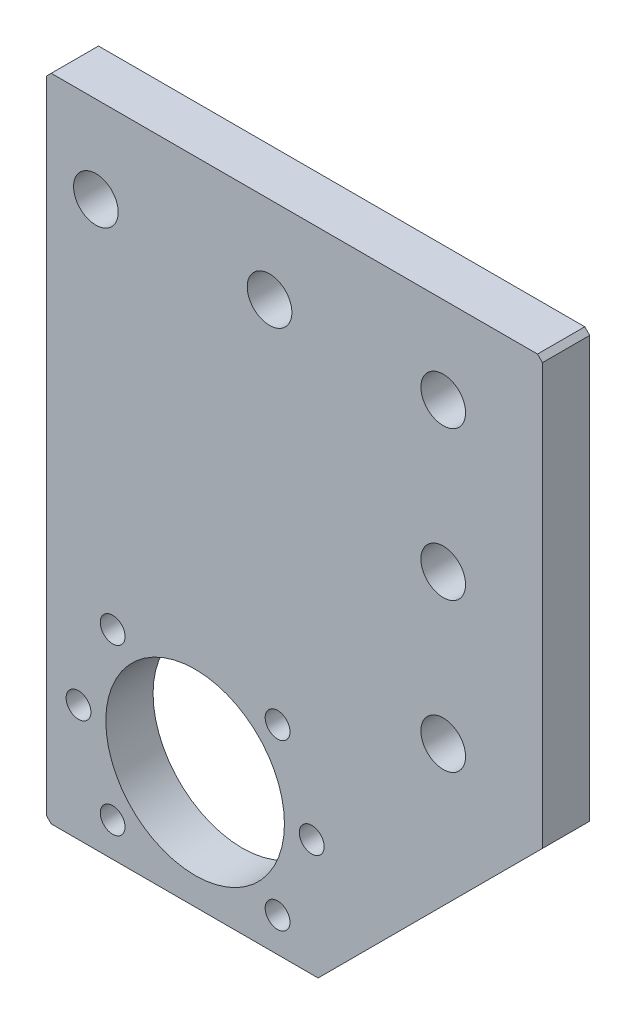
ISO-10303-21;
HEADER;
FILE_DESCRIPTION(('STEP AP214'),'2;1');
FILE_NAME('part.step','',(''),(''),'','','');
FILE_SCHEMA(('AUTOMOTIVE_DESIGN { 1 0 10303 214 1 1 1 1 }'));
ENDSEC;
DATA;
#1=APPLICATION_CONTEXT('core data for automotive mechanical design processes');
#2=APPLICATION_PROTOCOL_DEFINITION('international standard','automotive_design',2000,#1);
#3=PRODUCT_CONTEXT('',#1,'mechanical');
#4=PRODUCT('Part','Part','',(#3));
#5=PRODUCT_RELATED_PRODUCT_CATEGORY('part','',(#4));
#6=PRODUCT_DEFINITION_FORMATION('','',#4);
#7=PRODUCT_DEFINITION_CONTEXT('part definition',#1,'design');
#8=PRODUCT_DEFINITION('design','',#6,#7);
#9=PRODUCT_DEFINITION_SHAPE('','',#8);
#10=(LENGTH_UNIT() NAMED_UNIT(*) SI_UNIT(.MILLI.,.METRE.));
#11=(NAMED_UNIT(*) PLANE_ANGLE_UNIT() SI_UNIT($,.RADIAN.));
#12=(NAMED_UNIT(*) SI_UNIT($,.STERADIAN.) SOLID_ANGLE_UNIT());
#13=UNCERTAINTY_MEASURE_WITH_UNIT(LENGTH_MEASURE(1.E-05),#10,'distance_accuracy_value','');
#14=(GEOMETRIC_REPRESENTATION_CONTEXT(3) GLOBAL_UNCERTAINTY_ASSIGNED_CONTEXT((#13)) GLOBAL_UNIT_ASSIGNED_CONTEXT((#10,
#11,#12)) REPRESENTATION_CONTEXT('',''));
#15=CARTESIAN_POINT('',(0.,0.,0.));
#16=DIRECTION('',(0.,0.,1.));
#17=DIRECTION('',(1.,0.,0.));
#18=AXIS2_PLACEMENT_3D('',#15,#16,#17);
#19=CARTESIAN_POINT('',(0.,0.,4.7625));
#20=DIRECTION('',(0.,0.,-1.));
#21=DIRECTION('',(-1.,0.,0.));
#22=AXIS2_PLACEMENT_3D('',#19,#20,#21);
#23=PLANE('',#22);
#24=DIRECTION('',(0.,-1.,0.));
#25=VECTOR('',#24,1.);
#26=CARTESIAN_POINT('',(-30.,-23.5,4.7625));
#27=LINE('',#26,#25);
#28=CARTESIAN_POINT('',(-30.,106.5,4.7625));
#29=VERTEX_POINT('',#28);
#30=CARTESIAN_POINT('',(-30.,-22.5,4.7625));
#31=VERTEX_POINT('',#30);
#32=EDGE_CURVE('E124',#29,#31,#27,.T.);
#33=ORIENTED_EDGE('',*,*,#32,.T.);
#34=DIRECTION('',(-0.707106781186548,0.707106781186548,0.));
#35=VECTOR('',#34,1.);
#36=CARTESIAN_POINT('',(-29.,-23.5,4.7625));
#37=LINE('',#36,#35);
#38=CARTESIAN_POINT('',(-29.,-23.5,4.7625));
#39=VERTEX_POINT('',#38);
#40=EDGE_CURVE('E119',#31,#39,#37,.F.);
#41=ORIENTED_EDGE('',*,*,#40,.T.);
#42=DIRECTION('',(1.,0.,0.));
#43=VECTOR('',#42,1.);
#44=CARTESIAN_POINT('',(-30.,-23.5,4.7625));
#45=LINE('',#44,#43);
#46=CARTESIAN_POINT('',(24.7842712474621,-23.5,4.7625));
#47=VERTEX_POINT('',#46);
#48=EDGE_CURVE('E111',#39,#47,#45,.T.);
#49=ORIENTED_EDGE('',*,*,#48,.T.);
#50=DIRECTION('',(0.707106781186546,0.707106781186549,0.));
#51=VECTOR('',#50,1.);
#52=CARTESIAN_POINT('',(24.7842712474621,-23.5,4.7625));
#53=LINE('',#52,#51);
#54=CARTESIAN_POINT('',(70.,21.7157287525381,4.7625));
#55=VERTEX_POINT('',#54);
#56=EDGE_CURVE('E116',#47,#55,#53,.T.);
#57=ORIENTED_EDGE('',*,*,#56,.T.);
#58=DIRECTION('',(0.,1.,0.));
#59=VECTOR('',#58,1.);
#60=CARTESIAN_POINT('',(70.,21.7157287525381,4.7625));
#61=LINE('',#60,#59);
#62=CARTESIAN_POINT('',(70.,106.5,4.7625));
#63=VERTEX_POINT('',#62);
#64=EDGE_CURVE('E141',#55,#63,#61,.T.);
#65=ORIENTED_EDGE('',*,*,#64,.T.);
#66=DIRECTION('',(0.707106781186548,-0.707106781186548,0.));
#67=VECTOR('',#66,1.);
#68=CARTESIAN_POINT('',(69.,107.5,4.7625));
#69=LINE('',#68,#67);
#70=CARTESIAN_POINT('',(69.,107.5,4.7625));
#71=VERTEX_POINT('',#70);
#72=EDGE_CURVE('E69',#63,#71,#69,.F.);
#73=ORIENTED_EDGE('',*,*,#72,.T.);
#74=DIRECTION('',(-1.,0.,0.));
#75=VECTOR('',#74,1.);
#76=CARTESIAN_POINT('',(-30.,107.5,4.7625));
#77=LINE('',#76,#75);
#78=CARTESIAN_POINT('',(-29.,107.5,4.7625));
#79=VERTEX_POINT('',#78);
#80=EDGE_CURVE('E144',#71,#79,#77,.T.);
#81=ORIENTED_EDGE('',*,*,#80,.T.);
#82=DIRECTION('',(0.707106781186533,0.707106781186562,0.));
#83=VECTOR('',#82,1.);
#84=CARTESIAN_POINT('',(-30.,106.5,4.7625));
#85=LINE('',#84,#83);
#86=EDGE_CURVE('E187',#79,#29,#85,.F.);
#87=ORIENTED_EDGE('',*,*,#86,.T.);
#88=EDGE_LOOP('',(#33,#41,#49,#57,#65,#73,#81,#87));
#89=FACE_BOUND('',#88,.T.);
#90=CARTESIAN_POINT('',(0.,0.,4.7625));
#91=DIRECTION('',(0.,0.,1.));
#92=DIRECTION('',(1.,0.,0.));
#93=AXIS2_PLACEMENT_3D('',#90,#91,#92);
#94=CIRCLE('',#93,18.);
#95=CARTESIAN_POINT('',(-18.,0.,4.7625));
#96=VERTEX_POINT('',#95);
#97=EDGE_CURVE('E154',#96,#96,#94,.T.);
#98=ORIENTED_EDGE('',*,*,#97,.F.);
#99=EDGE_LOOP('',(#98));
#100=FACE_BOUND('',#99,.T.);
#101=CARTESIAN_POINT('',(50.,30.,4.7625));
#102=DIRECTION('',(0.,0.,1.));
#103=DIRECTION('',(1.,0.,0.));
#104=AXIS2_PLACEMENT_3D('',#101,#102,#103);
#105=CIRCLE('',#104,4.5);
#106=CARTESIAN_POINT('',(54.5,30.,4.7625));
#107=VERTEX_POINT('',#106);
#108=EDGE_CURVE('E226',#107,#107,#105,.T.);
#109=ORIENTED_EDGE('',*,*,#108,.F.);
#110=EDGE_LOOP('',(#109));
#111=FACE_BOUND('',#110,.T.);
#112=CARTESIAN_POINT('',(50.,60.,4.7625));
#113=DIRECTION('',(0.,0.,1.));
#114=DIRECTION('',(1.,0.,0.));
#115=AXIS2_PLACEMENT_3D('',#112,#113,#114);
#116=CIRCLE('',#115,4.5);
#117=CARTESIAN_POINT('',(54.5,60.,4.7625));
#118=VERTEX_POINT('',#117);
#119=EDGE_CURVE('E234',#118,#118,#116,.T.);
#120=ORIENTED_EDGE('',*,*,#119,.F.);
#121=EDGE_LOOP('',(#120));
#122=FACE_BOUND('',#121,.T.);
#123=CARTESIAN_POINT('',(50.,90.,4.7625));
#124=DIRECTION('',(0.,0.,1.));
#125=DIRECTION('',(1.,0.,0.));
#126=AXIS2_PLACEMENT_3D('',#123,#124,#125);
#127=CIRCLE('',#126,4.5);
#128=CARTESIAN_POINT('',(54.5,90.,4.7625));
#129=VERTEX_POINT('',#128);
#130=EDGE_CURVE('E242',#129,#129,#127,.T.);
#131=ORIENTED_EDGE('',*,*,#130,.F.);
#132=EDGE_LOOP('',(#131));
#133=FACE_BOUND('',#132,.T.);
#134=CARTESIAN_POINT('',(15.,90.,4.7625));
#135=DIRECTION('',(0.,0.,1.));
#136=DIRECTION('',(1.,0.,0.));
#137=AXIS2_PLACEMENT_3D('',#134,#135,#136);
#138=CIRCLE('',#137,4.5);
#139=CARTESIAN_POINT('',(19.5,90.,4.7625));
#140=VERTEX_POINT('',#139);
#141=EDGE_CURVE('E250',#140,#140,#138,.T.);
#142=ORIENTED_EDGE('',*,*,#141,.F.);
#143=EDGE_LOOP('',(#142));
#144=FACE_BOUND('',#143,.T.);
#145=CARTESIAN_POINT('',(-20.,90.,4.7625));
#146=DIRECTION('',(0.,0.,1.));
#147=DIRECTION('',(1.,0.,0.));
#148=AXIS2_PLACEMENT_3D('',#145,#146,#147);
#149=CIRCLE('',#148,4.5);
#150=CARTESIAN_POINT('',(-15.5,90.,4.7625));
#151=VERTEX_POINT('',#150);
#152=EDGE_CURVE('E258',#151,#151,#149,.T.);
#153=ORIENTED_EDGE('',*,*,#152,.F.);
#154=EDGE_LOOP('',(#153));
#155=FACE_BOUND('',#154,.T.);
#156=CARTESIAN_POINT('',(-16.6170093578841,16.6170093578837,4.7625));
#157=DIRECTION('',(0.,0.,1.));
#158=DIRECTION('',(1.,0.,0.));
#159=AXIS2_PLACEMENT_3D('',#156,#157,#158);
#160=CIRCLE('',#159,2.5);
#161=CARTESIAN_POINT('',(-14.1170093578841,16.6170093578837,4.7625));
#162=VERTEX_POINT('',#161);
#163=EDGE_CURVE('E266',#162,#162,#160,.T.);
#164=ORIENTED_EDGE('',*,*,#163,.F.);
#165=EDGE_LOOP('',(#164));
#166=FACE_BOUND('',#165,.T.);
#167=CARTESIAN_POINT('',(-23.5,-2.49756583940482E-13,4.7625));
#168=DIRECTION('',(0.,0.,1.));
#169=DIRECTION('',(1.,0.,0.));
#170=AXIS2_PLACEMENT_3D('',#167,#168,#169);
#171=CIRCLE('',#170,2.5);
#172=CARTESIAN_POINT('',(-21.,-2.49756583940482E-13,4.7625));
#173=VERTEX_POINT('',#172);
#174=EDGE_CURVE('E274',#173,#173,#171,.T.);
#175=ORIENTED_EDGE('',*,*,#174,.F.);
#176=EDGE_LOOP('',(#175));
#177=FACE_BOUND('',#176,.T.);
#178=CARTESIAN_POINT('',(-16.6170093578837,-16.617009357884,4.7625));
#179=DIRECTION('',(0.,0.,1.));
#180=DIRECTION('',(1.,0.,0.));
#181=AXIS2_PLACEMENT_3D('',#178,#179,#180);
#182=CIRCLE('',#181,2.5);
#183=CARTESIAN_POINT('',(-14.1170093578837,-16.617009357884,4.7625));
#184=VERTEX_POINT('',#183);
#185=EDGE_CURVE('E282',#184,#184,#182,.T.);
#186=ORIENTED_EDGE('',*,*,#185,.F.);
#187=EDGE_LOOP('',(#186));
#188=FACE_BOUND('',#187,.T.);
#189=CARTESIAN_POINT('',(16.6170093578839,-16.6170093578839,4.7625));
#190=DIRECTION('',(0.,0.,1.));
#191=DIRECTION('',(1.,0.,0.));
#192=AXIS2_PLACEMENT_3D('',#189,#190,#191);
#193=CIRCLE('',#192,2.5);
#194=CARTESIAN_POINT('',(19.1170093578839,-16.6170093578839,4.7625));
#195=VERTEX_POINT('',#194);
#196=EDGE_CURVE('E290',#195,#195,#193,.T.);
#197=ORIENTED_EDGE('',*,*,#196,.F.);
#198=EDGE_LOOP('',(#197));
#199=FACE_BOUND('',#198,.T.);
#200=CARTESIAN_POINT('',(23.5,0.,4.7625));
#201=DIRECTION('',(0.,0.,1.));
#202=DIRECTION('',(1.,0.,0.));
#203=AXIS2_PLACEMENT_3D('',#200,#201,#202);
#204=CIRCLE('',#203,2.5);
#205=CARTESIAN_POINT('',(26.,0.,4.7625));
#206=VERTEX_POINT('',#205);
#207=EDGE_CURVE('E298',#206,#206,#204,.T.);
#208=ORIENTED_EDGE('',*,*,#207,.F.);
#209=EDGE_LOOP('',(#208));
#210=FACE_BOUND('',#209,.T.);
#211=CARTESIAN_POINT('',(16.6170093578839,16.6170093578839,4.7625));
#212=DIRECTION('',(0.,0.,1.));
#213=DIRECTION('',(1.,0.,0.));
#214=AXIS2_PLACEMENT_3D('',#211,#212,#213);
#215=CIRCLE('',#214,2.5);
#216=CARTESIAN_POINT('',(19.1170093578839,16.6170093578839,4.7625));
#217=VERTEX_POINT('',#216);
#218=EDGE_CURVE('E306',#217,#217,#215,.T.);
#219=ORIENTED_EDGE('',*,*,#218,.F.);
#220=EDGE_LOOP('',(#219));
#221=FACE_BOUND('',#220,.T.);
#222=ADVANCED_FACE('F45',(#89,#100,#111,#122,#133,#144,#155,#166,#177,#188,#199,#210,#221),#23,.F.);
#223=CARTESIAN_POINT('',(0.,0.,-4.7625));
#224=DIRECTION('',(0.,0.,-1.));
#225=DIRECTION('',(-1.,0.,0.));
#226=AXIS2_PLACEMENT_3D('',#223,#224,#225);
#227=PLANE('',#226);
#228=CARTESIAN_POINT('',(16.6170093578839,16.6170093578839,-4.7625));
#229=DIRECTION('',(0.,0.,-1.));
#230=DIRECTION('',(-1.,0.,0.));
#231=AXIS2_PLACEMENT_3D('',#228,#229,#230);
#232=CIRCLE('',#231,2.5);
#233=CARTESIAN_POINT('',(14.1170093578839,16.6170093578839,-4.7625));
#234=VERTEX_POINT('',#233);
#235=EDGE_CURVE('E302',#234,#234,#232,.T.);
#236=ORIENTED_EDGE('',*,*,#235,.F.);
#237=EDGE_LOOP('',(#236));
#238=FACE_BOUND('',#237,.T.);
#239=CARTESIAN_POINT('',(23.5,0.,-4.7625));
#240=DIRECTION('',(0.,0.,-1.));
#241=DIRECTION('',(-1.,0.,0.));
#242=AXIS2_PLACEMENT_3D('',#239,#240,#241);
#243=CIRCLE('',#242,2.5);
#244=CARTESIAN_POINT('',(21.,0.,-4.7625));
#245=VERTEX_POINT('',#244);
#246=EDGE_CURVE('E294',#245,#245,#243,.T.);
#247=ORIENTED_EDGE('',*,*,#246,.F.);
#248=EDGE_LOOP('',(#247));
#249=FACE_BOUND('',#248,.T.);
#250=CARTESIAN_POINT('',(16.6170093578839,-16.6170093578839,-4.7625));
#251=DIRECTION('',(0.,0.,-1.));
#252=DIRECTION('',(-1.,0.,0.));
#253=AXIS2_PLACEMENT_3D('',#250,#251,#252);
#254=CIRCLE('',#253,2.5);
#255=CARTESIAN_POINT('',(14.1170093578839,-16.6170093578839,-4.7625));
#256=VERTEX_POINT('',#255);
#257=EDGE_CURVE('E286',#256,#256,#254,.T.);
#258=ORIENTED_EDGE('',*,*,#257,.F.);
#259=EDGE_LOOP('',(#258));
#260=FACE_BOUND('',#259,.T.);
#261=CARTESIAN_POINT('',(-16.6170093578837,-16.617009357884,-4.7625));
#262=DIRECTION('',(0.,0.,-1.));
#263=DIRECTION('',(-1.,0.,0.));
#264=AXIS2_PLACEMENT_3D('',#261,#262,#263);
#265=CIRCLE('',#264,2.5);
#266=CARTESIAN_POINT('',(-19.1170093578837,-16.617009357884,-4.7625));
#267=VERTEX_POINT('',#266);
#268=EDGE_CURVE('E278',#267,#267,#265,.T.);
#269=ORIENTED_EDGE('',*,*,#268,.F.);
#270=EDGE_LOOP('',(#269));
#271=FACE_BOUND('',#270,.T.);
#272=CARTESIAN_POINT('',(-23.5,-2.49756583940482E-13,-4.7625));
#273=DIRECTION('',(0.,0.,-1.));
#274=DIRECTION('',(-1.,0.,0.));
#275=AXIS2_PLACEMENT_3D('',#272,#273,#274);
#276=CIRCLE('',#275,2.5);
#277=CARTESIAN_POINT('',(-26.,-2.49756583940482E-13,-4.7625));
#278=VERTEX_POINT('',#277);
#279=EDGE_CURVE('E270',#278,#278,#276,.T.);
#280=ORIENTED_EDGE('',*,*,#279,.F.);
#281=EDGE_LOOP('',(#280));
#282=FACE_BOUND('',#281,.T.);
#283=CARTESIAN_POINT('',(-16.6170093578841,16.6170093578837,-4.7625));
#284=DIRECTION('',(0.,0.,-1.));
#285=DIRECTION('',(-1.,0.,0.));
#286=AXIS2_PLACEMENT_3D('',#283,#284,#285);
#287=CIRCLE('',#286,2.5);
#288=CARTESIAN_POINT('',(-19.1170093578841,16.6170093578837,-4.7625));
#289=VERTEX_POINT('',#288);
#290=EDGE_CURVE('E262',#289,#289,#287,.T.);
#291=ORIENTED_EDGE('',*,*,#290,.F.);
#292=EDGE_LOOP('',(#291));
#293=FACE_BOUND('',#292,.T.);
#294=CARTESIAN_POINT('',(-20.,90.,-4.7625));
#295=DIRECTION('',(0.,0.,-1.));
#296=DIRECTION('',(-1.,0.,0.));
#297=AXIS2_PLACEMENT_3D('',#294,#295,#296);
#298=CIRCLE('',#297,4.5);
#299=CARTESIAN_POINT('',(-24.5,90.,-4.7625));
#300=VERTEX_POINT('',#299);
#301=EDGE_CURVE('E254',#300,#300,#298,.T.);
#302=ORIENTED_EDGE('',*,*,#301,.F.);
#303=EDGE_LOOP('',(#302));
#304=FACE_BOUND('',#303,.T.);
#305=CARTESIAN_POINT('',(15.,90.,-4.7625));
#306=DIRECTION('',(0.,0.,-1.));
#307=DIRECTION('',(-1.,0.,0.));
#308=AXIS2_PLACEMENT_3D('',#305,#306,#307);
#309=CIRCLE('',#308,4.5);
#310=CARTESIAN_POINT('',(10.5,90.,-4.7625));
#311=VERTEX_POINT('',#310);
#312=EDGE_CURVE('E246',#311,#311,#309,.T.);
#313=ORIENTED_EDGE('',*,*,#312,.F.);
#314=EDGE_LOOP('',(#313));
#315=FACE_BOUND('',#314,.T.);
#316=CARTESIAN_POINT('',(50.,90.,-4.7625));
#317=DIRECTION('',(0.,0.,-1.));
#318=DIRECTION('',(-1.,0.,0.));
#319=AXIS2_PLACEMENT_3D('',#316,#317,#318);
#320=CIRCLE('',#319,4.5);
#321=CARTESIAN_POINT('',(45.5,90.,-4.7625));
#322=VERTEX_POINT('',#321);
#323=EDGE_CURVE('E238',#322,#322,#320,.T.);
#324=ORIENTED_EDGE('',*,*,#323,.F.);
#325=EDGE_LOOP('',(#324));
#326=FACE_BOUND('',#325,.T.);
#327=CARTESIAN_POINT('',(50.,60.,-4.7625));
#328=DIRECTION('',(0.,0.,-1.));
#329=DIRECTION('',(-1.,0.,0.));
#330=AXIS2_PLACEMENT_3D('',#327,#328,#329);
#331=CIRCLE('',#330,4.5);
#332=CARTESIAN_POINT('',(45.5,60.,-4.7625));
#333=VERTEX_POINT('',#332);
#334=EDGE_CURVE('E230',#333,#333,#331,.T.);
#335=ORIENTED_EDGE('',*,*,#334,.F.);
#336=EDGE_LOOP('',(#335));
#337=FACE_BOUND('',#336,.T.);
#338=CARTESIAN_POINT('',(50.,30.,-4.7625));
#339=DIRECTION('',(0.,0.,-1.));
#340=DIRECTION('',(-1.,0.,0.));
#341=AXIS2_PLACEMENT_3D('',#338,#339,#340);
#342=CIRCLE('',#341,4.5);
#343=CARTESIAN_POINT('',(45.5,30.,-4.7625));
#344=VERTEX_POINT('',#343);
#345=EDGE_CURVE('E219',#344,#344,#342,.T.);
#346=ORIENTED_EDGE('',*,*,#345,.F.);
#347=EDGE_LOOP('',(#346));
#348=FACE_BOUND('',#347,.T.);
#349=DIRECTION('',(1.,0.,0.));
#350=VECTOR('',#349,1.);
#351=CARTESIAN_POINT('',(-30.,-23.5,-4.7625));
#352=LINE('',#351,#350);
#353=CARTESIAN_POINT('',(-29.,-23.5,-4.7625));
#354=VERTEX_POINT('',#353);
#355=CARTESIAN_POINT('',(24.7842712474621,-23.5,-4.7625));
#356=VERTEX_POINT('',#355);
#357=EDGE_CURVE('E130',#354,#356,#352,.T.);
#358=ORIENTED_EDGE('',*,*,#357,.F.);
#359=DIRECTION('',(0.707106781186548,-0.707106781186548,0.));
#360=VECTOR('',#359,1.);
#361=CARTESIAN_POINT('',(-26.25,-26.25,-4.7625));
#362=LINE('',#361,#360);
#363=CARTESIAN_POINT('',(-30.,-22.5,-4.7625));
#364=VERTEX_POINT('',#363);
#365=EDGE_CURVE('E177',#354,#364,#362,.F.);
#366=ORIENTED_EDGE('',*,*,#365,.T.);
#367=DIRECTION('',(0.,-1.,0.));
#368=VECTOR('',#367,1.);
#369=CARTESIAN_POINT('',(-30.,-23.5,-4.7625));
#370=LINE('',#369,#368);
#371=CARTESIAN_POINT('',(-30.,106.5,-4.7625));
#372=VERTEX_POINT('',#371);
#373=EDGE_CURVE('E150',#372,#364,#370,.T.);
#374=ORIENTED_EDGE('',*,*,#373,.F.);
#375=DIRECTION('',(-0.707106781186533,-0.707106781186562,0.));
#376=VECTOR('',#375,1.);
#377=CARTESIAN_POINT('',(-68.2500000000006,68.2499999999978,-4.7625));
#378=LINE('',#377,#376);
#379=CARTESIAN_POINT('',(-29.,107.5,-4.7625));
#380=VERTEX_POINT('',#379);
#381=EDGE_CURVE('E171',#372,#380,#378,.F.);
#382=ORIENTED_EDGE('',*,*,#381,.T.);
#383=DIRECTION('',(-1.,0.,0.));
#384=VECTOR('',#383,1.);
#385=CARTESIAN_POINT('',(-30.,107.5,-4.7625));
#386=LINE('',#385,#384);
#387=CARTESIAN_POINT('',(69.,107.5,-4.7625));
#388=VERTEX_POINT('',#387);
#389=EDGE_CURVE('E164',#388,#380,#386,.T.);
#390=ORIENTED_EDGE('',*,*,#389,.F.);
#391=DIRECTION('',(-0.707106781186548,0.707106781186548,0.));
#392=VECTOR('',#391,1.);
#393=CARTESIAN_POINT('',(88.25,88.25,-4.7625));
#394=LINE('',#393,#392);
#395=CARTESIAN_POINT('',(70.,106.5,-4.7625));
#396=VERTEX_POINT('',#395);
#397=EDGE_CURVE('E174',#388,#396,#394,.F.);
#398=ORIENTED_EDGE('',*,*,#397,.T.);
#399=DIRECTION('',(0.,1.,0.));
#400=VECTOR('',#399,1.);
#401=CARTESIAN_POINT('',(70.,21.7157287525381,-4.7625));
#402=LINE('',#401,#400);
#403=CARTESIAN_POINT('',(70.,21.7157287525381,-4.7625));
#404=VERTEX_POINT('',#403);
#405=EDGE_CURVE('E160',#404,#396,#402,.T.);
#406=ORIENTED_EDGE('',*,*,#405,.F.);
#407=DIRECTION('',(0.707106781186546,0.707106781186549,0.));
#408=VECTOR('',#407,1.);
#409=CARTESIAN_POINT('',(24.7842712474621,-23.5,-4.7625));
#410=LINE('',#409,#408);
#411=EDGE_CURVE('E157',#356,#404,#410,.T.);
#412=ORIENTED_EDGE('',*,*,#411,.F.);
#413=EDGE_LOOP('',(#358,#366,#374,#382,#390,#398,#406,#412));
#414=FACE_BOUND('',#413,.T.);
#415=CARTESIAN_POINT('',(0.,0.,-4.7625));
#416=DIRECTION('',(0.,0.,1.));
#417=DIRECTION('',(1.,0.,0.));
#418=AXIS2_PLACEMENT_3D('',#415,#416,#417);
#419=CIRCLE('',#418,18.);
#420=CARTESIAN_POINT('',(-18.,0.,-4.7625));
#421=VERTEX_POINT('',#420);
#422=EDGE_CURVE('E215',#421,#421,#419,.T.);
#423=ORIENTED_EDGE('',*,*,#422,.T.);
#424=EDGE_LOOP('',(#423));
#425=FACE_BOUND('',#424,.T.);
#426=ADVANCED_FACE('F202',(#238,#249,#260,#271,#282,#293,#304,#315,#326,#337,#348,#414,#425),
#227,.T.);
#427=CARTESIAN_POINT('',(-30.,-23.5,4.7625));
#428=DIRECTION('',(1.,0.,0.));
#429=DIRECTION('',(0.,0.,-1.));
#430=AXIS2_PLACEMENT_3D('',#427,#428,#429);
#431=PLANE('',#430);
#432=ORIENTED_EDGE('',*,*,#373,.T.);
#433=DIRECTION('',(0.,0.,1.));
#434=VECTOR('',#433,1.);
#435=CARTESIAN_POINT('',(-30.,-22.5,4.7625));
#436=LINE('',#435,#434);
#437=EDGE_CURVE('E184',#364,#31,#436,.T.);
#438=ORIENTED_EDGE('',*,*,#437,.T.);
#439=ORIENTED_EDGE('',*,*,#32,.F.);
#440=DIRECTION('',(0.,0.,-1.));
#441=VECTOR('',#440,1.);
#442=CARTESIAN_POINT('',(-30.,106.5,4.7625));
#443=LINE('',#442,#441);
#444=EDGE_CURVE('E180',#29,#372,#443,.T.);
#445=ORIENTED_EDGE('',*,*,#444,.T.);
#446=EDGE_LOOP('',(#432,#438,#439,#445));
#447=FACE_BOUND('',#446,.T.);
#448=ADVANCED_FACE('F211',(#447),#431,.F.);
#449=CARTESIAN_POINT('',(-30.,-23.5,4.7625));
#450=DIRECTION('',(0.,1.,0.));
#451=DIRECTION('',(0.,0.,1.));
#452=AXIS2_PLACEMENT_3D('',#449,#450,#451);
#453=PLANE('',#452);
#454=ORIENTED_EDGE('',*,*,#48,.F.);
#455=DIRECTION('',(0.,0.,-1.));
#456=VECTOR('',#455,1.);
#457=CARTESIAN_POINT('',(-29.,-23.5,4.7625));
#458=LINE('',#457,#456);
#459=EDGE_CURVE('E134',#39,#354,#458,.T.);
#460=ORIENTED_EDGE('',*,*,#459,.T.);
#461=ORIENTED_EDGE('',*,*,#357,.T.);
#462=DIRECTION('',(0.,0.,-1.));
#463=VECTOR('',#462,1.);
#464=CARTESIAN_POINT('',(24.7842712474621,-23.5,4.7625));
#465=LINE('',#464,#463);
#466=EDGE_CURVE('E127',#47,#356,#465,.T.);
#467=ORIENTED_EDGE('',*,*,#466,.F.);
#468=EDGE_LOOP('',(#454,#460,#461,#467));
#469=FACE_BOUND('',#468,.T.);
#470=ADVANCED_FACE('F128',(#469),#453,.F.);
#471=CARTESIAN_POINT('',(24.7842712474621,-23.5,4.7625));
#472=DIRECTION('',(-0.707106781186549,0.707106781186546,0.));
#473=DIRECTION('',(-0.707106781186546,-0.707106781186549,0.));
#474=AXIS2_PLACEMENT_3D('',#471,#472,#473);
#475=PLANE('',#474);
#476=ORIENTED_EDGE('',*,*,#411,.T.);
#477=DIRECTION('',(0.,0.,-1.));
#478=VECTOR('',#477,1.);
#479=CARTESIAN_POINT('',(70.,21.7157287525381,4.7625));
#480=LINE('',#479,#478);
#481=EDGE_CURVE('E135',#55,#404,#480,.T.);
#482=ORIENTED_EDGE('',*,*,#481,.F.);
#483=ORIENTED_EDGE('',*,*,#56,.F.);
#484=ORIENTED_EDGE('',*,*,#466,.T.);
#485=EDGE_LOOP('',(#476,#482,#483,#484));
#486=FACE_BOUND('',#485,.T.);
#487=ADVANCED_FACE('F137',(#486),#475,.F.);
#488=CARTESIAN_POINT('',(70.,21.7157287525381,4.7625));
#489=DIRECTION('',(-1.,0.,0.));
#490=DIRECTION('',(0.,0.,1.));
#491=AXIS2_PLACEMENT_3D('',#488,#489,#490);
#492=PLANE('',#491);
#493=ORIENTED_EDGE('',*,*,#405,.T.);
#494=DIRECTION('',(0.,0.,1.));
#495=VECTOR('',#494,1.);
#496=CARTESIAN_POINT('',(70.,106.5,4.7625));
#497=LINE('',#496,#495);
#498=EDGE_CURVE('E11',#396,#63,#497,.T.);
#499=ORIENTED_EDGE('',*,*,#498,.T.);
#500=ORIENTED_EDGE('',*,*,#64,.F.);
#501=ORIENTED_EDGE('',*,*,#481,.T.);
#502=EDGE_LOOP('',(#493,#499,#500,#501));
#503=FACE_BOUND('',#502,.T.);
#504=ADVANCED_FACE('F327',(#503),#492,.F.);
#505=CARTESIAN_POINT('',(-30.,107.5,4.7625));
#506=DIRECTION('',(0.,-1.,0.));
#507=DIRECTION('',(0.,0.,-1.));
#508=AXIS2_PLACEMENT_3D('',#505,#506,#507);
#509=PLANE('',#508);
#510=ORIENTED_EDGE('',*,*,#80,.F.);
#511=DIRECTION('',(0.,0.,-1.));
#512=VECTOR('',#511,1.);
#513=CARTESIAN_POINT('',(69.,107.5,4.7625));
#514=LINE('',#513,#512);
#515=EDGE_CURVE('E55',#71,#388,#514,.T.);
#516=ORIENTED_EDGE('',*,*,#515,.T.);
#517=ORIENTED_EDGE('',*,*,#389,.T.);
#518=DIRECTION('',(0.,0.,1.));
#519=VECTOR('',#518,1.);
#520=CARTESIAN_POINT('',(-29.,107.5,4.7625));
#521=LINE('',#520,#519);
#522=EDGE_CURVE('E62',#380,#79,#521,.T.);
#523=ORIENTED_EDGE('',*,*,#522,.T.);
#524=EDGE_LOOP('',(#510,#516,#517,#523));
#525=FACE_BOUND('',#524,.T.);
#526=ADVANCED_FACE('F199',(#525),#509,.F.);
#527=CARTESIAN_POINT('',(0.,0.,4.7625));
#528=DIRECTION('',(0.,0.,-1.));
#529=DIRECTION('',(-1.,0.,0.));
#530=AXIS2_PLACEMENT_3D('',#527,#528,#529);
#531=CYLINDRICAL_SURFACE('',#530,18.);
#532=CARTESIAN_POINT('',(-18.,0.,4.7625));
#533=CARTESIAN_POINT('',(-18.,0.,4.66328125));
#534=CARTESIAN_POINT('',(-18.,0.,4.5640625));
#535=CARTESIAN_POINT('',(-18.,0.,4.365625));
#536=CARTESIAN_POINT('',(-18.,0.,4.26640625));
#537=CARTESIAN_POINT('',(-18.,0.,4.06796875));
#538=CARTESIAN_POINT('',(-18.,0.,3.96875));
#539=CARTESIAN_POINT('',(-18.,0.,3.7703125));
#540=CARTESIAN_POINT('',(-18.,0.,3.67109375));
#541=CARTESIAN_POINT('',(-18.,0.,3.47265625));
#542=CARTESIAN_POINT('',(-18.,0.,3.3734375));
#543=CARTESIAN_POINT('',(-18.,0.,3.175));
#544=CARTESIAN_POINT('',(-18.,0.,3.07578125));
#545=CARTESIAN_POINT('',(-18.,0.,2.87734375));
#546=CARTESIAN_POINT('',(-18.,0.,2.778125));
#547=CARTESIAN_POINT('',(-18.,0.,2.5796875));
#548=CARTESIAN_POINT('',(-18.,0.,2.48046875));
#549=CARTESIAN_POINT('',(-18.,0.,2.28203125));
#550=CARTESIAN_POINT('',(-18.,0.,2.1828125));
#551=CARTESIAN_POINT('',(-18.,0.,1.984375));
#552=CARTESIAN_POINT('',(-18.,0.,1.88515625));
#553=CARTESIAN_POINT('',(-18.,0.,1.68671875));
#554=CARTESIAN_POINT('',(-18.,0.,1.5875));
#555=CARTESIAN_POINT('',(-18.,0.,1.3890625));
#556=CARTESIAN_POINT('',(-18.,0.,1.28984375));
#557=CARTESIAN_POINT('',(-18.,0.,1.09140625));
#558=CARTESIAN_POINT('',(-18.,0.,0.992187499999999));
#559=CARTESIAN_POINT('',(-18.,0.,0.793749999999999));
#560=CARTESIAN_POINT('',(-18.,0.,0.694531249999999));
#561=CARTESIAN_POINT('',(-18.,0.,0.496093749999999));
#562=CARTESIAN_POINT('',(-18.,0.,0.396874999999999));
#563=CARTESIAN_POINT('',(-18.,0.,0.198437499999999));
#564=CARTESIAN_POINT('',(-18.,0.,0.0992187499999992));
#565=CARTESIAN_POINT('',(-18.,0.,-0.0992187500000009));
#566=CARTESIAN_POINT('',(-18.,0.,-0.198437500000001));
#567=CARTESIAN_POINT('',(-18.,0.,-0.396875000000001));
#568=CARTESIAN_POINT('',(-18.,0.,-0.496093750000001));
#569=CARTESIAN_POINT('',(-18.,0.,-0.694531250000001));
#570=CARTESIAN_POINT('',(-18.,0.,-0.793750000000001));
#571=CARTESIAN_POINT('',(-18.,0.,-0.992187500000002));
#572=CARTESIAN_POINT('',(-18.,0.,-1.09140625));
#573=CARTESIAN_POINT('',(-18.,0.,-1.28984375));
#574=CARTESIAN_POINT('',(-18.,0.,-1.3890625));
#575=CARTESIAN_POINT('',(-18.,0.,-1.5875));
#576=CARTESIAN_POINT('',(-18.,0.,-1.68671875));
#577=CARTESIAN_POINT('',(-18.,0.,-1.88515625));
#578=CARTESIAN_POINT('',(-18.,0.,-1.984375));
#579=CARTESIAN_POINT('',(-18.,0.,-2.1828125));
#580=CARTESIAN_POINT('',(-18.,0.,-2.28203125));
#581=CARTESIAN_POINT('',(-18.,0.,-2.48046875));
#582=CARTESIAN_POINT('',(-18.,0.,-2.5796875));
#583=CARTESIAN_POINT('',(-18.,0.,-2.778125));
#584=CARTESIAN_POINT('',(-18.,0.,-2.87734375));
#585=CARTESIAN_POINT('',(-18.,0.,-3.07578125));
#586=CARTESIAN_POINT('',(-18.,0.,-3.175));
#587=CARTESIAN_POINT('',(-18.,0.,-3.3734375));
#588=CARTESIAN_POINT('',(-18.,0.,-3.47265625));
#589=CARTESIAN_POINT('',(-18.,0.,-3.67109375));
#590=CARTESIAN_POINT('',(-18.,0.,-3.7703125));
#591=CARTESIAN_POINT('',(-18.,0.,-3.96875));
#592=CARTESIAN_POINT('',(-18.,0.,-4.06796875));
#593=CARTESIAN_POINT('',(-18.,0.,-4.26640625));
#594=CARTESIAN_POINT('',(-18.,0.,-4.365625));
#595=CARTESIAN_POINT('',(-18.,0.,-4.5640625));
#596=CARTESIAN_POINT('',(-18.,0.,-4.66328125));
#597=CARTESIAN_POINT('',(-18.,0.,-4.7625));
#598=B_SPLINE_CURVE_WITH_KNOTS('',3,(#532,#533,#534,#535,#536,#537,#538,#539,#540,#541,#542,
#543,#544,#545,#546,#547,#548,#549,#550,#551,#552,#553,#554,#555,#556,#557,#558,#559,#560,#561,
#562,#563,#564,#565,#566,#567,#568,#569,#570,#571,#572,#573,#574,#575,#576,#577,#578,#579,#580,
#581,#582,#583,#584,#585,#586,#587,#588,#589,#590,#591,#592,#593,#594,#595,#596,#597),
.UNSPECIFIED.,.F.,.F.,(4,2,2,2,2,2,2,2,2,2,2,2,2,2,2,2,2,2,2,2,2,2,2,2,2,2,2,2,2,2,2,2,4),(0.,
0.297656249999999,0.595312499999999,0.89296875,1.190625,1.48828125,1.7859375,2.08359375,2.38125,
2.67890625,2.9765625,3.27421875,3.571875,3.86953125,4.1671875,4.46484375,4.7625,5.06015625,
5.3578125,5.65546875,5.953125,6.25078125,6.5484375,6.84609375,7.14375,7.44140625,7.7390625,
8.03671875,8.334375,8.63203125,8.9296875,9.22734375,9.525),.UNSPECIFIED.);
#599=EDGE_CURVE('BSEAM322',#96,#421,#598,.T.);
#600=ORIENTED_EDGE('',*,*,#97,.T.);
#601=ORIENTED_EDGE('',*,*,#422,.F.);
#602=ORIENTED_EDGE('',*,*,#599,.T.);
#603=ORIENTED_EDGE('',*,*,#599,.F.);
#604=EDGE_LOOP('',(#600,#602,#601,#603));
#605=FACE_BOUND('',#604,.T.);
#606=ADVANCED_FACE('F322',(#605),#531,.F.);
#607=CARTESIAN_POINT('',(50.,30.,4.7625));
#608=DIRECTION('',(0.,0.,1.));
#609=DIRECTION('',(1.,0.,0.));
#610=AXIS2_PLACEMENT_3D('',#607,#608,#609);
#611=CYLINDRICAL_SURFACE('',#610,4.5);
#612=ORIENTED_EDGE('',*,*,#108,.T.);
#613=EDGE_LOOP('',(#612));
#614=FACE_BOUND('',#613,.T.);
#615=ORIENTED_EDGE('',*,*,#345,.T.);
#616=EDGE_LOOP('',(#615));
#617=FACE_BOUND('',#616,.T.);
#618=ADVANCED_FACE('F513',(#614,#617),#611,.F.);
#619=CARTESIAN_POINT('',(50.,60.,4.7625));
#620=DIRECTION('',(0.,0.,1.));
#621=DIRECTION('',(1.,0.,0.));
#622=AXIS2_PLACEMENT_3D('',#619,#620,#621);
#623=CYLINDRICAL_SURFACE('',#622,4.5);
#624=ORIENTED_EDGE('',*,*,#119,.T.);
#625=EDGE_LOOP('',(#624));
#626=FACE_BOUND('',#625,.T.);
#627=ORIENTED_EDGE('',*,*,#334,.T.);
#628=EDGE_LOOP('',(#627));
#629=FACE_BOUND('',#628,.T.);
#630=ADVANCED_FACE('F503',(#626,#629),#623,.F.);
#631=CARTESIAN_POINT('',(50.,90.,4.7625));
#632=DIRECTION('',(0.,0.,1.));
#633=DIRECTION('',(1.,0.,0.));
#634=AXIS2_PLACEMENT_3D('',#631,#632,#633);
#635=CYLINDRICAL_SURFACE('',#634,4.5);
#636=ORIENTED_EDGE('',*,*,#130,.T.);
#637=EDGE_LOOP('',(#636));
#638=FACE_BOUND('',#637,.T.);
#639=ORIENTED_EDGE('',*,*,#323,.T.);
#640=EDGE_LOOP('',(#639));
#641=FACE_BOUND('',#640,.T.);
#642=ADVANCED_FACE('F493',(#638,#641),#635,.F.);
#643=CARTESIAN_POINT('',(15.,90.,4.7625));
#644=DIRECTION('',(0.,0.,1.));
#645=DIRECTION('',(1.,0.,0.));
#646=AXIS2_PLACEMENT_3D('',#643,#644,#645);
#647=CYLINDRICAL_SURFACE('',#646,4.5);
#648=ORIENTED_EDGE('',*,*,#141,.T.);
#649=EDGE_LOOP('',(#648));
#650=FACE_BOUND('',#649,.T.);
#651=ORIENTED_EDGE('',*,*,#312,.T.);
#652=EDGE_LOOP('',(#651));
#653=FACE_BOUND('',#652,.T.);
#654=ADVANCED_FACE('F483',(#650,#653),#647,.F.);
#655=CARTESIAN_POINT('',(-20.,90.,4.7625));
#656=DIRECTION('',(0.,0.,1.));
#657=DIRECTION('',(1.,0.,0.));
#658=AXIS2_PLACEMENT_3D('',#655,#656,#657);
#659=CYLINDRICAL_SURFACE('',#658,4.5);
#660=ORIENTED_EDGE('',*,*,#152,.T.);
#661=EDGE_LOOP('',(#660));
#662=FACE_BOUND('',#661,.T.);
#663=ORIENTED_EDGE('',*,*,#301,.T.);
#664=EDGE_LOOP('',(#663));
#665=FACE_BOUND('',#664,.T.);
#666=ADVANCED_FACE('F471',(#662,#665),#659,.F.);
#667=CARTESIAN_POINT('',(-16.6170093578841,16.6170093578837,4.7625));
#668=DIRECTION('',(0.,0.,1.));
#669=DIRECTION('',(1.,0.,0.));
#670=AXIS2_PLACEMENT_3D('',#667,#668,#669);
#671=CYLINDRICAL_SURFACE('',#670,2.5);
#672=ORIENTED_EDGE('',*,*,#163,.T.);
#673=EDGE_LOOP('',(#672));
#674=FACE_BOUND('',#673,.T.);
#675=ORIENTED_EDGE('',*,*,#290,.T.);
#676=EDGE_LOOP('',(#675));
#677=FACE_BOUND('',#676,.T.);
#678=ADVANCED_FACE('F459',(#674,#677),#671,.F.);
#679=CARTESIAN_POINT('',(-23.5,-2.49756583940482E-13,4.7625));
#680=DIRECTION('',(0.,0.,1.));
#681=DIRECTION('',(1.,0.,0.));
#682=AXIS2_PLACEMENT_3D('',#679,#680,#681);
#683=CYLINDRICAL_SURFACE('',#682,2.5);
#684=ORIENTED_EDGE('',*,*,#174,.T.);
#685=EDGE_LOOP('',(#684));
#686=FACE_BOUND('',#685,.T.);
#687=ORIENTED_EDGE('',*,*,#279,.T.);
#688=EDGE_LOOP('',(#687));
#689=FACE_BOUND('',#688,.T.);
#690=ADVANCED_FACE('F447',(#686,#689),#683,.F.);
#691=CARTESIAN_POINT('',(-16.6170093578837,-16.617009357884,4.7625));
#692=DIRECTION('',(0.,0.,1.));
#693=DIRECTION('',(1.,0.,0.));
#694=AXIS2_PLACEMENT_3D('',#691,#692,#693);
#695=CYLINDRICAL_SURFACE('',#694,2.5);
#696=ORIENTED_EDGE('',*,*,#185,.T.);
#697=EDGE_LOOP('',(#696));
#698=FACE_BOUND('',#697,.T.);
#699=ORIENTED_EDGE('',*,*,#268,.T.);
#700=EDGE_LOOP('',(#699));
#701=FACE_BOUND('',#700,.T.);
#702=ADVANCED_FACE('F435',(#698,#701),#695,.F.);
#703=CARTESIAN_POINT('',(16.6170093578839,-16.6170093578839,4.7625));
#704=DIRECTION('',(0.,0.,1.));
#705=DIRECTION('',(1.,0.,0.));
#706=AXIS2_PLACEMENT_3D('',#703,#704,#705);
#707=CYLINDRICAL_SURFACE('',#706,2.5);
#708=ORIENTED_EDGE('',*,*,#196,.T.);
#709=EDGE_LOOP('',(#708));
#710=FACE_BOUND('',#709,.T.);
#711=ORIENTED_EDGE('',*,*,#257,.T.);
#712=EDGE_LOOP('',(#711));
#713=FACE_BOUND('',#712,.T.);
#714=ADVANCED_FACE('F423',(#710,#713),#707,.F.);
#715=CARTESIAN_POINT('',(23.5,0.,4.7625));
#716=DIRECTION('',(0.,0.,1.));
#717=DIRECTION('',(1.,0.,0.));
#718=AXIS2_PLACEMENT_3D('',#715,#716,#717);
#719=CYLINDRICAL_SURFACE('',#718,2.5);
#720=ORIENTED_EDGE('',*,*,#207,.T.);
#721=EDGE_LOOP('',(#720));
#722=FACE_BOUND('',#721,.T.);
#723=ORIENTED_EDGE('',*,*,#246,.T.);
#724=EDGE_LOOP('',(#723));
#725=FACE_BOUND('',#724,.T.);
#726=ADVANCED_FACE('F413',(#722,#725),#719,.F.);
#727=CARTESIAN_POINT('',(16.6170093578839,16.6170093578839,4.7625));
#728=DIRECTION('',(0.,0.,1.));
#729=DIRECTION('',(1.,0.,0.));
#730=AXIS2_PLACEMENT_3D('',#727,#728,#729);
#731=CYLINDRICAL_SURFACE('',#730,2.5);
#732=ORIENTED_EDGE('',*,*,#218,.T.);
#733=EDGE_LOOP('',(#732));
#734=FACE_BOUND('',#733,.T.);
#735=ORIENTED_EDGE('',*,*,#235,.T.);
#736=EDGE_LOOP('',(#735));
#737=FACE_BOUND('',#736,.T.);
#738=ADVANCED_FACE('F311',(#734,#737),#731,.F.);
#739=CARTESIAN_POINT('',(-29.,-23.5,4.7625));
#740=DIRECTION('',(0.707106781186547,0.707106781186547,0.));
#741=DIRECTION('',(0.,0.,-1.));
#742=AXIS2_PLACEMENT_3D('',#739,#740,#741);
#743=PLANE('',#742);
#744=ORIENTED_EDGE('',*,*,#40,.F.);
#745=ORIENTED_EDGE('',*,*,#437,.F.);
#746=ORIENTED_EDGE('',*,*,#365,.F.);
#747=ORIENTED_EDGE('',*,*,#459,.F.);
#748=EDGE_LOOP('',(#744,#745,#746,#747));
#749=FACE_BOUND('',#748,.T.);
#750=ADVANCED_FACE('F338',(#749),#743,.F.);
#751=CARTESIAN_POINT('',(69.,107.5,4.7625));
#752=DIRECTION('',(-0.707106781186547,-0.707106781186547,0.));
#753=DIRECTION('',(0.,0.,-1.));
#754=AXIS2_PLACEMENT_3D('',#751,#752,#753);
#755=PLANE('',#754);
#756=ORIENTED_EDGE('',*,*,#72,.F.);
#757=ORIENTED_EDGE('',*,*,#498,.F.);
#758=ORIENTED_EDGE('',*,*,#397,.F.);
#759=ORIENTED_EDGE('',*,*,#515,.F.);
#760=EDGE_LOOP('',(#756,#757,#758,#759));
#761=FACE_BOUND('',#760,.T.);
#762=ADVANCED_FACE('F343',(#761),#755,.F.);
#763=CARTESIAN_POINT('',(-30.,106.5,4.7625));
#764=DIRECTION('',(0.707106781186562,-0.707106781186533,0.));
#765=DIRECTION('',(0.,0.,-1.));
#766=AXIS2_PLACEMENT_3D('',#763,#764,#765);
#767=PLANE('',#766);
#768=ORIENTED_EDGE('',*,*,#86,.F.);
#769=ORIENTED_EDGE('',*,*,#522,.F.);
#770=ORIENTED_EDGE('',*,*,#381,.F.);
#771=ORIENTED_EDGE('',*,*,#444,.F.);
#772=EDGE_LOOP('',(#768,#769,#770,#771));
#773=FACE_BOUND('',#772,.T.);
#774=ADVANCED_FACE('F48',(#773),#767,.F.);
#775=CLOSED_SHELL('',(#222,#426,#448,#470,#487,#504,#526,#606,#618,#630,#642,#654,#666,#678,
#690,#702,#714,#726,#738,#750,#762,#774));
#776=MANIFOLD_SOLID_BREP('B2',#775);
#777=ADVANCED_BREP_SHAPE_REPRESENTATION('',(#18,#776),#14);
#778=SHAPE_DEFINITION_REPRESENTATION(#9,#777);
ENDSEC;
END-ISO-10303-21;
